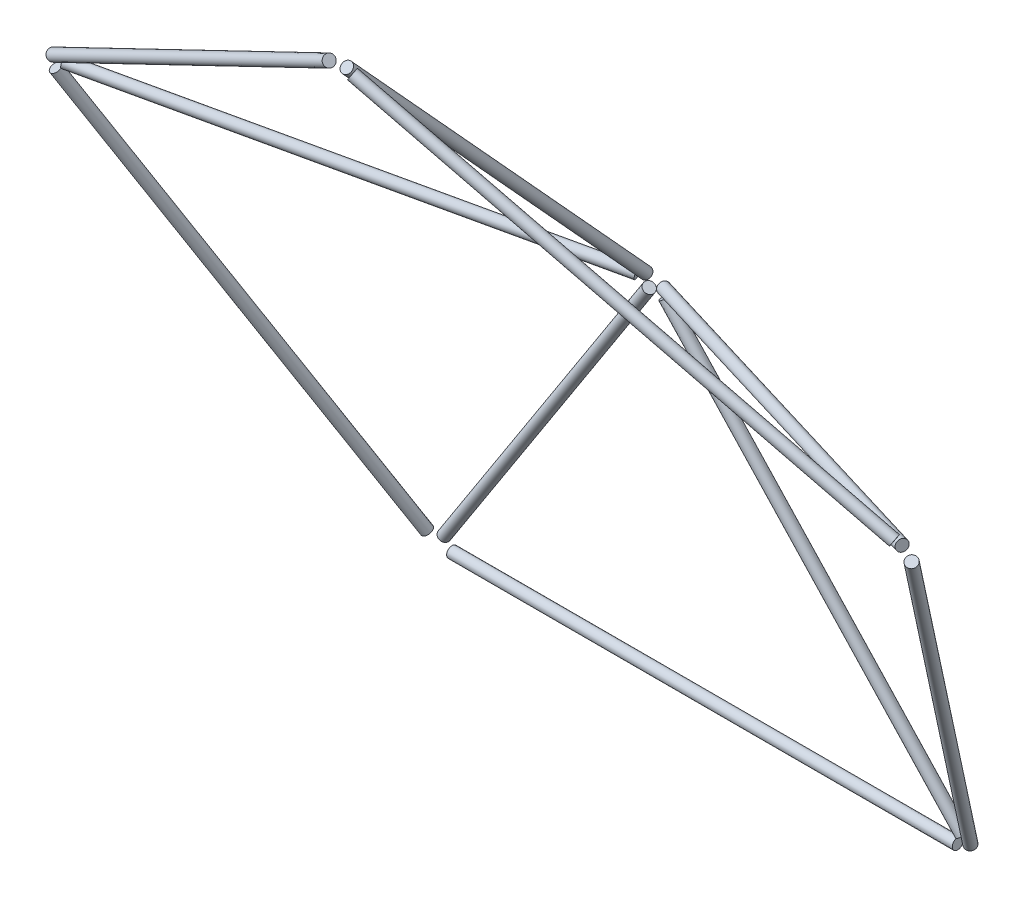
ISO-10303-21;
HEADER;
FILE_DESCRIPTION(('STEP AP214'),'2;1');
FILE_NAME('part.step','',(''),(''),'','','');
FILE_SCHEMA(('AUTOMOTIVE_DESIGN { 1 0 10303 214 1 1 1 1 }'));
ENDSEC;
DATA;
#1=APPLICATION_CONTEXT('core data for automotive mechanical design processes');
#2=APPLICATION_PROTOCOL_DEFINITION('international standard','automotive_design',2000,#1);
#3=PRODUCT_CONTEXT('',#1,'mechanical');
#4=PRODUCT('Part','Part','',(#3));
#5=PRODUCT_RELATED_PRODUCT_CATEGORY('part','',(#4));
#6=PRODUCT_DEFINITION_FORMATION('','',#4);
#7=PRODUCT_DEFINITION_CONTEXT('part definition',#1,'design');
#8=PRODUCT_DEFINITION('design','',#6,#7);
#9=PRODUCT_DEFINITION_SHAPE('','',#8);
#10=(LENGTH_UNIT() NAMED_UNIT(*) SI_UNIT(.MILLI.,.METRE.));
#11=(NAMED_UNIT(*) PLANE_ANGLE_UNIT() SI_UNIT($,.RADIAN.));
#12=(NAMED_UNIT(*) SI_UNIT($,.STERADIAN.) SOLID_ANGLE_UNIT());
#13=UNCERTAINTY_MEASURE_WITH_UNIT(LENGTH_MEASURE(1.E-05),#10,'distance_accuracy_value','');
#14=(GEOMETRIC_REPRESENTATION_CONTEXT(3) GLOBAL_UNCERTAINTY_ASSIGNED_CONTEXT((#13)) GLOBAL_UNIT_ASSIGNED_CONTEXT((#10,
#11,#12)) REPRESENTATION_CONTEXT('',''));
#15=CARTESIAN_POINT('',(0.,0.,0.));
#16=DIRECTION('',(0.,0.,1.));
#17=DIRECTION('',(1.,0.,0.));
#18=AXIS2_PLACEMENT_3D('',#15,#16,#17);
#19=CARTESIAN_POINT('',(3.23606797750098,202.053269556013,-127.226929132831));
#20=DIRECTION('',(0.809016994374942,-0.525731112119141,-0.262865556059569));
#21=DIRECTION('',(0.,0.447213595499956,-0.894427190999917));
#22=AXIS2_PLACEMENT_3D('',#19,#20,#21);
#23=PLANE('',#22);
#24=CARTESIAN_POINT('',(3.23606797750098,202.053269556013,-127.226929132831));
#25=DIRECTION('',(0.809016994374942,-0.525731112119141,-0.262865556059569));
#26=DIRECTION('',(0.,0.447213595499956,-0.894427190999917));
#27=AXIS2_PLACEMENT_3D('',#24,#25,#26);
#28=CIRCLE('',#27,1.49999999999999);
#29=CARTESIAN_POINT('',(3.23606797750098,202.724089949263,-128.568569919331));
#30=VERTEX_POINT('',#29);
#31=EDGE_CURVE('E51',#30,#30,#28,.T.);
#32=ORIENTED_EDGE('',*,*,#31,.F.);
#33=EDGE_LOOP('',(#32));
#34=FACE_BOUND('',#33,.T.);
#35=ADVANCED_FACE('F45',(#34),#23,.F.);
#36=CARTESIAN_POINT('',(116.763932022501,128.278391357067,-164.114368232304));
#37=DIRECTION('',(0.809016994374942,-0.525731112119141,-0.262865556059569));
#38=DIRECTION('',(0.,0.447213595499956,-0.894427190999917));
#39=AXIS2_PLACEMENT_3D('',#36,#37,#38);
#40=PLANE('',#39);
#41=CARTESIAN_POINT('',(116.763932022501,128.278391357067,-164.114368232304));
#42=DIRECTION('',(0.809016994374942,-0.525731112119141,-0.262865556059569));
#43=DIRECTION('',(0.,0.447213595499956,-0.894427190999917));
#44=AXIS2_PLACEMENT_3D('',#41,#42,#43);
#45=CIRCLE('',#44,1.49999999999999);
#46=CARTESIAN_POINT('',(116.763932022501,128.949211750317,-165.456009018804));
#47=VERTEX_POINT('',#46);
#48=EDGE_CURVE('E11',#47,#47,#45,.T.);
#49=ORIENTED_EDGE('',*,*,#48,.T.);
#50=EDGE_LOOP('',(#49));
#51=FACE_BOUND('',#50,.T.);
#52=ADVANCED_FACE('F60',(#51),#40,.T.);
#53=CARTESIAN_POINT('',(3.23606797750098,202.053269556013,-127.226929132831));
#54=DIRECTION('',(0.809016994374941,-0.525731112119142,-0.262865556059569));
#55=DIRECTION('',(0.,0.447213595499955,-0.894427190999917));
#56=AXIS2_PLACEMENT_3D('',#53,#54,#55);
#57=CYLINDRICAL_SURFACE('',#56,1.49999999999999);
#58=ORIENTED_EDGE('',*,*,#48,.F.);
#59=EDGE_LOOP('',(#58));
#60=FACE_BOUND('',#59,.T.);
#61=ORIENTED_EDGE('',*,*,#31,.T.);
#62=EDGE_LOOP('',(#61));
#63=FACE_BOUND('',#62,.T.);
#64=ADVANCED_FACE('F57',(#60,#63),#57,.T.);
#65=CLOSED_SHELL('',(#35,#52,#64));
#66=MANIFOLD_SOLID_BREP('B2',#65);
#67=CARTESIAN_POINT('',(-116.763932022499,128.278391357069,-164.114368232303));
#68=DIRECTION('',(0.809016994374952,0.525731112119129,0.262865556059564));
#69=DIRECTION('',(0.,0.447213595499955,-0.894427190999918));
#70=AXIS2_PLACEMENT_3D('',#67,#68,#69);
#71=PLANE('',#70);
#72=CARTESIAN_POINT('',(-116.763932022499,128.278391357069,-164.114368232303));
#73=DIRECTION('',(0.809016994374952,0.525731112119129,0.262865556059564));
#74=DIRECTION('',(0.,0.447213595499955,-0.894427190999918));
#75=AXIS2_PLACEMENT_3D('',#72,#73,#74);
#76=CIRCLE('',#75,1.49999999999999);
#77=CARTESIAN_POINT('',(-116.763932022499,128.949211750319,-165.456009018803));
#78=VERTEX_POINT('',#77);
#79=EDGE_CURVE('E99',#78,#78,#76,.T.);
#80=ORIENTED_EDGE('',*,*,#79,.F.);
#81=EDGE_LOOP('',(#80));
#82=FACE_BOUND('',#81,.T.);
#83=ADVANCED_FACE('F93',(#82),#71,.F.);
#84=CARTESIAN_POINT('',(-3.23606797749835,202.053269556013,-127.226929132831));
#85=DIRECTION('',(0.809016994374952,0.525731112119129,0.262865556059564));
#86=DIRECTION('',(0.,0.447213595499955,-0.894427190999918));
#87=AXIS2_PLACEMENT_3D('',#84,#85,#86);
#88=PLANE('',#87);
#89=CARTESIAN_POINT('',(-3.23606797749835,202.053269556013,-127.226929132831));
#90=DIRECTION('',(0.809016994374952,0.525731112119129,0.262865556059564));
#91=DIRECTION('',(0.,0.447213595499955,-0.894427190999918));
#92=AXIS2_PLACEMENT_3D('',#89,#90,#91);
#93=CIRCLE('',#92,1.49999999999999);
#94=CARTESIAN_POINT('',(-3.23606797749835,202.724089949263,-128.568569919331));
#95=VERTEX_POINT('',#94);
#96=EDGE_CURVE('E44',#95,#95,#93,.T.);
#97=ORIENTED_EDGE('',*,*,#96,.T.);
#98=EDGE_LOOP('',(#97));
#99=FACE_BOUND('',#98,.T.);
#100=ADVANCED_FACE('F108',(#99),#88,.T.);
#101=CARTESIAN_POINT('',(-116.763932022499,128.278391357069,-164.114368232303));
#102=DIRECTION('',(0.809016994374952,0.525731112119128,0.262865556059563));
#103=DIRECTION('',(0.,0.447213595499955,-0.894427190999917));
#104=AXIS2_PLACEMENT_3D('',#101,#102,#103);
#105=CYLINDRICAL_SURFACE('',#104,1.49999999999999);
#106=ORIENTED_EDGE('',*,*,#96,.F.);
#107=EDGE_LOOP('',(#106));
#108=FACE_BOUND('',#107,.T.);
#109=ORIENTED_EDGE('',*,*,#79,.T.);
#110=EDGE_LOOP('',(#109));
#111=FACE_BOUND('',#110,.T.);
#112=ADVANCED_FACE('F105',(#108,#111),#105,.T.);
#113=CLOSED_SHELL('',(#83,#100,#112));
#114=MANIFOLD_SOLID_BREP('B6',#113);
#115=CARTESIAN_POINT('',(-75.4001466274869,3.4026032334083,-226.552262294133));
#116=DIRECTION('',(-0.309016994374944,0.850650808352042,0.425325404176018));
#117=DIRECTION('',(0.,0.447213595499956,-0.894427190999917));
#118=AXIS2_PLACEMENT_3D('',#115,#116,#117);
#119=PLANE('',#118);
#120=CARTESIAN_POINT('',(-75.4001466274869,3.4026032334083,-226.552262294133));
#121=DIRECTION('',(-0.309016994374944,0.850650808352042,0.425325404176018));
#122=DIRECTION('',(0.,0.447213595499956,-0.894427190999917));
#123=AXIS2_PLACEMENT_3D('',#120,#121,#122);
#124=CIRCLE('',#123,1.49999999999999);
#125=CARTESIAN_POINT('',(-75.4001466274869,4.07342362665823,-227.893903080633));
#126=VERTEX_POINT('',#125);
#127=EDGE_CURVE('E147',#126,#126,#124,.T.);
#128=ORIENTED_EDGE('',*,*,#127,.F.);
#129=EDGE_LOOP('',(#128));
#130=FACE_BOUND('',#129,.T.);
#131=ADVANCED_FACE('F141',(#130),#119,.F.);
#132=CARTESIAN_POINT('',(-118.763932022499,122.772863675184,-166.867132073245));
#133=DIRECTION('',(-0.309016994374944,0.850650808352042,0.425325404176018));
#134=DIRECTION('',(0.,0.447213595499956,-0.894427190999917));
#135=AXIS2_PLACEMENT_3D('',#132,#133,#134);
#136=PLANE('',#135);
#137=CARTESIAN_POINT('',(-118.763932022499,122.772863675184,-166.867132073245));
#138=DIRECTION('',(-0.309016994374944,0.850650808352042,0.425325404176018));
#139=DIRECTION('',(0.,0.447213595499956,-0.894427190999917));
#140=AXIS2_PLACEMENT_3D('',#137,#138,#139);
#141=CIRCLE('',#140,1.49999999999999);
#142=CARTESIAN_POINT('',(-118.763932022499,123.443684068434,-168.208772859745));
#143=VERTEX_POINT('',#142);
#144=EDGE_CURVE('E92',#143,#143,#141,.T.);
#145=ORIENTED_EDGE('',*,*,#144,.T.);
#146=EDGE_LOOP('',(#145));
#147=FACE_BOUND('',#146,.T.);
#148=ADVANCED_FACE('F156',(#147),#136,.T.);
#149=CARTESIAN_POINT('',(-75.4001466274869,3.4026032334083,-226.552262294133));
#150=DIRECTION('',(-0.309016994374943,0.850650808352043,0.425325404176018));
#151=DIRECTION('',(0.,0.447213595499956,-0.894427190999916));
#152=AXIS2_PLACEMENT_3D('',#149,#150,#151);
#153=CYLINDRICAL_SURFACE('',#152,1.49999999999999);
#154=ORIENTED_EDGE('',*,*,#144,.F.);
#155=EDGE_LOOP('',(#154));
#156=FACE_BOUND('',#155,.T.);
#157=ORIENTED_EDGE('',*,*,#127,.T.);
#158=EDGE_LOOP('',(#157));
#159=FACE_BOUND('',#158,.T.);
#160=ADVANCED_FACE('F153',(#156,#159),#153,.T.);
#161=CLOSED_SHELL('',(#131,#148,#160));
#162=MANIFOLD_SOLID_BREP('B39',#161);
#163=CARTESIAN_POINT('',(70.1640786499878,0.,-228.253563910838));
#164=DIRECTION('',(-1.,0.,0.));
#165=DIRECTION('',(0.,0.447213595499958,-0.89442719099992));
#166=AXIS2_PLACEMENT_3D('',#163,#164,#165);
#167=PLANE('',#166);
#168=CARTESIAN_POINT('',(70.1640786499878,0.,-228.253563910838));
#169=DIRECTION('',(-1.,0.,0.));
#170=DIRECTION('',(0.,0.447213595499958,-0.89442719099992));
#171=AXIS2_PLACEMENT_3D('',#168,#169,#170);
#172=CIRCLE('',#171,1.49999999999999);
#173=CARTESIAN_POINT('',(70.1640786499878,0.670820393249941,-229.595204697338));
#174=VERTEX_POINT('',#173);
#175=EDGE_CURVE('E195',#174,#174,#172,.T.);
#176=ORIENTED_EDGE('',*,*,#175,.F.);
#177=EDGE_LOOP('',(#176));
#178=FACE_BOUND('',#177,.T.);
#179=ADVANCED_FACE('F189',(#178),#167,.F.);
#180=CARTESIAN_POINT('',(-70.1640786499873,3.46944695195361E-13,-228.253563910838));
#181=DIRECTION('',(-1.,0.,0.));
#182=DIRECTION('',(0.,0.447213595499958,-0.89442719099992));
#183=AXIS2_PLACEMENT_3D('',#180,#181,#182);
#184=PLANE('',#183);
#185=CARTESIAN_POINT('',(-70.1640786499873,3.46944695195361E-13,-228.253563910838));
#186=DIRECTION('',(-1.,0.,0.));
#187=DIRECTION('',(0.,0.447213595499958,-0.89442719099992));
#188=AXIS2_PLACEMENT_3D('',#185,#186,#187);
#189=CIRCLE('',#188,1.49999999999999);
#190=CARTESIAN_POINT('',(-70.1640786499873,0.670820393250281,-229.595204697338));
#191=VERTEX_POINT('',#190);
#192=EDGE_CURVE('E140',#191,#191,#189,.T.);
#193=ORIENTED_EDGE('',*,*,#192,.T.);
#194=EDGE_LOOP('',(#193));
#195=FACE_BOUND('',#194,.T.);
#196=ADVANCED_FACE('F204',(#195),#184,.T.);
#197=CARTESIAN_POINT('',(70.1640786499878,0.,-228.253563910838));
#198=DIRECTION('',(-1.,0.,0.));
#199=DIRECTION('',(0.,0.447213595499958,-0.89442719099992));
#200=AXIS2_PLACEMENT_3D('',#197,#198,#199);
#201=CYLINDRICAL_SURFACE('',#200,1.49999999999999);
#202=ORIENTED_EDGE('',*,*,#192,.F.);
#203=EDGE_LOOP('',(#202));
#204=FACE_BOUND('',#203,.T.);
#205=ORIENTED_EDGE('',*,*,#175,.T.);
#206=EDGE_LOOP('',(#205));
#207=FACE_BOUND('',#206,.T.);
#208=ADVANCED_FACE('F201',(#204,#207),#201,.T.);
#209=CLOSED_SHELL('',(#179,#196,#208));
#210=MANIFOLD_SOLID_BREP('B87',#209);
#211=CARTESIAN_POINT('',(3.65943097377863,107.90592178459,-213.153111338437));
#212=DIRECTION('',(0.914857743444677,0.143664716150187,0.377353625387172));
#213=DIRECTION('',(-0.229343174999504,0.954060902804784,0.192793936161055));
#214=AXIS2_PLACEMENT_3D('',#211,#212,#213);
#215=PLANE('',#214);
#216=CARTESIAN_POINT('',(3.65943097377863,107.90592178459,-213.153111338437));
#217=DIRECTION('',(0.914857743444677,0.143664716150187,0.377353625387172));
#218=DIRECTION('',(-0.229343174999504,0.954060902804784,0.192793936161055));
#219=AXIS2_PLACEMENT_3D('',#216,#217,#218);
#220=CIRCLE('',#219,1.5);
#221=CARTESIAN_POINT('',(3.31541621127938,109.337013138797,-212.863920434195));
#222=VERTEX_POINT('',#221);
#223=EDGE_CURVE('E243',#222,#222,#220,.T.);
#224=ORIENTED_EDGE('',*,*,#223,.F.);
#225=EDGE_LOOP('',(#224));
#226=FACE_BOUND('',#225,.T.);
#227=ADVANCED_FACE('F237',(#226),#215,.F.);
#228=CARTESIAN_POINT('',(116.340569026225,125.60080804399,-166.675244958095));
#229=DIRECTION('',(0.914857743444677,0.143664716150187,0.377353625387172));
#230=DIRECTION('',(-0.229343174999504,0.954060902804784,0.192793936161055));
#231=AXIS2_PLACEMENT_3D('',#228,#229,#230);
#232=PLANE('',#231);
#233=CARTESIAN_POINT('',(116.340569026225,125.60080804399,-166.675244958095));
#234=DIRECTION('',(0.914857743444677,0.143664716150187,0.377353625387172));
#235=DIRECTION('',(-0.229343174999504,0.954060902804784,0.192793936161055));
#236=AXIS2_PLACEMENT_3D('',#233,#234,#235);
#237=CIRCLE('',#236,1.5);
#238=CARTESIAN_POINT('',(115.996554263725,127.031899398197,-166.386054053853));
#239=VERTEX_POINT('',#238);
#240=EDGE_CURVE('E188',#239,#239,#237,.T.);
#241=ORIENTED_EDGE('',*,*,#240,.T.);
#242=EDGE_LOOP('',(#241));
#243=FACE_BOUND('',#242,.T.);
#244=ADVANCED_FACE('F252',(#243),#232,.T.);
#245=CARTESIAN_POINT('',(3.65943097377863,107.90592178459,-213.153111338437));
#246=DIRECTION('',(0.914857743444679,0.143664716150186,0.377353625387173));
#247=DIRECTION('',(-0.229343174999503,0.954060902804784,0.192793936161055));
#248=AXIS2_PLACEMENT_3D('',#245,#246,#247);
#249=CYLINDRICAL_SURFACE('',#248,1.5);
#250=ORIENTED_EDGE('',*,*,#240,.F.);
#251=EDGE_LOOP('',(#250));
#252=FACE_BOUND('',#251,.T.);
#253=ORIENTED_EDGE('',*,*,#223,.T.);
#254=EDGE_LOOP('',(#253));
#255=FACE_BOUND('',#254,.T.);
#256=ADVANCED_FACE('F249',(#252,#255),#249,.T.);
#257=CLOSED_SHELL('',(#227,#244,#256));
#258=MANIFOLD_SOLID_BREP('B135',#257);
#259=CARTESIAN_POINT('',(4.44089209850063E-13,110.283964185361,-211.964090138051));
#260=DIRECTION('',(0.,0.738175316342915,0.67460892548354));
#261=DIRECTION('',(-0.964443775627127,0.178291116075975,-0.195090957203359));
#262=AXIS2_PLACEMENT_3D('',#259,#260,#261);
#263=PLANE('',#262);
#264=CARTESIAN_POINT('',(4.44089209850063E-13,110.283964185361,-211.964090138051));
#265=DIRECTION('',(0.,0.738175316342915,0.67460892548354));
#266=DIRECTION('',(-0.964443775627127,0.178291116075975,-0.195090957203359));
#267=AXIS2_PLACEMENT_3D('',#264,#265,#266);
#268=CIRCLE('',#267,1.5);
#269=CARTESIAN_POINT('',(-1.44666566344024,110.551400859475,-212.256726573856));
#270=VERTEX_POINT('',#269);
#271=EDGE_CURVE('E291',#270,#270,#268,.T.);
#272=ORIENTED_EDGE('',*,*,#271,.F.);
#273=EDGE_LOOP('',(#272));
#274=FACE_BOUND('',#273,.T.);
#275=ADVANCED_FACE('F285',(#274),#263,.F.);
#276=CARTESIAN_POINT('',(1.48492329543615E-12,201.203492739118,-128.87390261053));
#277=DIRECTION('',(0.,0.738175316342915,0.67460892548354));
#278=DIRECTION('',(-0.964443775627127,0.178291116075975,-0.195090957203359));
#279=AXIS2_PLACEMENT_3D('',#276,#277,#278);
#280=PLANE('',#279);
#281=CARTESIAN_POINT('',(1.48492329543615E-12,201.203492739118,-128.87390261053));
#282=DIRECTION('',(0.,0.738175316342915,0.67460892548354));
#283=DIRECTION('',(-0.964443775627127,0.178291116075975,-0.195090957203359));
#284=AXIS2_PLACEMENT_3D('',#281,#282,#283);
#285=CIRCLE('',#284,1.5);
#286=CARTESIAN_POINT('',(-1.4466656634392,201.470929413231,-129.166539046335));
#287=VERTEX_POINT('',#286);
#288=EDGE_CURVE('E236',#287,#287,#285,.T.);
#289=ORIENTED_EDGE('',*,*,#288,.T.);
#290=EDGE_LOOP('',(#289));
#291=FACE_BOUND('',#290,.T.);
#292=ADVANCED_FACE('F300',(#291),#280,.T.);
#293=CARTESIAN_POINT('',(4.44089209850063E-13,110.283964185361,-211.964090138051));
#294=DIRECTION('',(0.,0.738175316342915,0.674608925483541));
#295=DIRECTION('',(-0.964443775627128,0.178291116075975,-0.195090957203356));
#296=AXIS2_PLACEMENT_3D('',#293,#294,#295);
#297=CYLINDRICAL_SURFACE('',#296,1.5);
#298=ORIENTED_EDGE('',*,*,#288,.F.);
#299=EDGE_LOOP('',(#298));
#300=FACE_BOUND('',#299,.T.);
#301=ORIENTED_EDGE('',*,*,#271,.T.);
#302=EDGE_LOOP('',(#301));
#303=FACE_BOUND('',#302,.T.);
#304=ADVANCED_FACE('F297',(#300,#303),#297,.T.);
#305=CLOSED_SHELL('',(#275,#292,#304));
#306=MANIFOLD_SOLID_BREP('B183',#305);
#307=CARTESIAN_POINT('',(-3.65943097377794,107.90592178459,-213.153111338437));
#308=DIRECTION('',(-0.914857743444675,0.1436647161502,0.377353625387176));
#309=DIRECTION('',(-0.366715858576331,-0.686748851889798,-0.627610941186252));
#310=AXIS2_PLACEMENT_3D('',#307,#308,#309);
#311=PLANE('',#310);
#312=CARTESIAN_POINT('',(-3.65943097377794,107.90592178459,-213.153111338437));
#313=DIRECTION('',(-0.914857743444675,0.1436647161502,0.377353625387176));
#314=DIRECTION('',(-0.366715858576331,-0.686748851889798,-0.627610941186252));
#315=AXIS2_PLACEMENT_3D('',#312,#313,#314);
#316=CIRCLE('',#315,1.5);
#317=CARTESIAN_POINT('',(-4.20950476164243,106.875798506756,-214.094527750216));
#318=VERTEX_POINT('',#317);
#319=EDGE_CURVE('E339',#318,#318,#316,.T.);
#320=ORIENTED_EDGE('',*,*,#319,.F.);
#321=EDGE_LOOP('',(#320));
#322=FACE_BOUND('',#321,.T.);
#323=ADVANCED_FACE('F333',(#322),#311,.F.);
#324=CARTESIAN_POINT('',(-116.340569026223,125.600808043992,-166.675244958094));
#325=DIRECTION('',(-0.914857743444675,0.1436647161502,0.377353625387176));
#326=DIRECTION('',(-0.366715858576331,-0.686748851889798,-0.627610941186252));
#327=AXIS2_PLACEMENT_3D('',#324,#325,#326);
#328=PLANE('',#327);
#329=CARTESIAN_POINT('',(-116.340569026223,125.600808043992,-166.675244958094));
#330=DIRECTION('',(-0.914857743444675,0.1436647161502,0.377353625387176));
#331=DIRECTION('',(-0.366715858576331,-0.686748851889798,-0.627610941186252));
#332=AXIS2_PLACEMENT_3D('',#329,#330,#331);
#333=CIRCLE('',#332,1.5);
#334=CARTESIAN_POINT('',(-116.890642814088,124.570684766157,-167.616661369873));
#335=VERTEX_POINT('',#334);
#336=EDGE_CURVE('E284',#335,#335,#333,.T.);
#337=ORIENTED_EDGE('',*,*,#336,.T.);
#338=EDGE_LOOP('',(#337));
#339=FACE_BOUND('',#338,.T.);
#340=ADVANCED_FACE('F348',(#339),#328,.T.);
#341=CARTESIAN_POINT('',(-3.65943097377794,107.90592178459,-213.153111338437));
#342=DIRECTION('',(-0.914857743444674,0.143664716150201,0.377353625387177));
#343=DIRECTION('',(-0.366715858576333,-0.686748851889798,-0.627610941186251));
#344=AXIS2_PLACEMENT_3D('',#341,#342,#343);
#345=CYLINDRICAL_SURFACE('',#344,1.5);
#346=ORIENTED_EDGE('',*,*,#336,.F.);
#347=EDGE_LOOP('',(#346));
#348=FACE_BOUND('',#347,.T.);
#349=ORIENTED_EDGE('',*,*,#319,.T.);
#350=EDGE_LOOP('',(#349));
#351=FACE_BOUND('',#350,.T.);
#352=ADVANCED_FACE('F345',(#348,#351),#345,.T.);
#353=CLOSED_SHELL('',(#323,#340,#352));
#354=MANIFOLD_SOLID_BREP('B231',#353);
#355=CARTESIAN_POINT('',(-2.26165272127875,104.058168353455,-215.076988054005));
#356=DIRECTION('',(-0.565413180319841,-0.818273641633722,-0.103615553504793));
#357=DIRECTION('',(0.737800910813355,-0.445603166990952,-0.507038098736824));
#358=AXIS2_PLACEMENT_3D('',#355,#356,#357);
#359=PLANE('',#358);
#360=CARTESIAN_POINT('',(-2.26165272127875,104.058168353455,-215.076988054005));
#361=DIRECTION('',(-0.565413180319841,-0.818273641633722,-0.103615553504793));
#362=DIRECTION('',(0.737800910813355,-0.445603166990952,-0.507038098736824));
#363=AXIS2_PLACEMENT_3D('',#360,#361,#362);
#364=CIRCLE('',#363,1.5);
#365=CARTESIAN_POINT('',(-1.15495135505872,103.389763602969,-215.83754520211));
#366=VERTEX_POINT('',#365);
#367=EDGE_CURVE('E387',#366,#366,#364,.T.);
#368=ORIENTED_EDGE('',*,*,#367,.F.);
#369=EDGE_LOOP('',(#368));
#370=FACE_BOUND('',#369,.T.);
#371=ADVANCED_FACE('F381',(#370),#359,.F.);
#372=CARTESIAN_POINT('',(-71.9024259287097,3.27309456653526,-227.839101696823));
#373=DIRECTION('',(-0.565413180319841,-0.818273641633722,-0.103615553504793));
#374=DIRECTION('',(0.737800910813355,-0.445603166990952,-0.507038098736824));
#375=AXIS2_PLACEMENT_3D('',#372,#373,#374);
#376=PLANE('',#375);
#377=CARTESIAN_POINT('',(-71.9024259287097,3.27309456653526,-227.839101696823));
#378=DIRECTION('',(-0.565413180319841,-0.818273641633722,-0.103615553504793));
#379=DIRECTION('',(0.737800910813355,-0.445603166990952,-0.507038098736824));
#380=AXIS2_PLACEMENT_3D('',#377,#378,#379);
#381=CIRCLE('',#380,1.5);
#382=CARTESIAN_POINT('',(-70.7957245624896,2.60468981604883,-228.599658844928));
#383=VERTEX_POINT('',#382);
#384=EDGE_CURVE('E332',#383,#383,#381,.T.);
#385=ORIENTED_EDGE('',*,*,#384,.T.);
#386=EDGE_LOOP('',(#385));
#387=FACE_BOUND('',#386,.T.);
#388=ADVANCED_FACE('F396',(#387),#376,.T.);
#389=CARTESIAN_POINT('',(-2.26165272127875,104.058168353455,-215.076988054005));
#390=DIRECTION('',(-0.565413180319843,-0.818273641633721,-0.103615553504791));
#391=DIRECTION('',(0.737800910813355,-0.445603166990953,-0.507038098736824));
#392=AXIS2_PLACEMENT_3D('',#389,#390,#391);
#393=CYLINDRICAL_SURFACE('',#392,1.5);
#394=ORIENTED_EDGE('',*,*,#384,.F.);
#395=EDGE_LOOP('',(#394));
#396=FACE_BOUND('',#395,.T.);
#397=ORIENTED_EDGE('',*,*,#367,.T.);
#398=EDGE_LOOP('',(#397));
#399=FACE_BOUND('',#398,.T.);
#400=ADVANCED_FACE('F393',(#396,#399),#393,.T.);
#401=CLOSED_SHELL('',(#371,#388,#400));
#402=MANIFOLD_SOLID_BREP('B279',#401);
#403=CARTESIAN_POINT('',(118.7639320225,122.772863675184,-166.867132073245));
#404=DIRECTION('',(-0.309016994374946,-0.850650808352041,-0.42532540417602));
#405=DIRECTION('',(0.,0.447213595499957,-0.894427190999916));
#406=AXIS2_PLACEMENT_3D('',#403,#404,#405);
#407=PLANE('',#406);
#408=CARTESIAN_POINT('',(118.7639320225,122.772863675184,-166.867132073245));
#409=DIRECTION('',(-0.309016994374946,-0.850650808352041,-0.42532540417602));
#410=DIRECTION('',(0.,0.447213595499957,-0.894427190999916));
#411=AXIS2_PLACEMENT_3D('',#408,#409,#410);
#412=CIRCLE('',#411,1.49999999999999);
#413=CARTESIAN_POINT('',(118.7639320225,123.443684068434,-168.208772859745));
#414=VERTEX_POINT('',#413);
#415=EDGE_CURVE('E435',#414,#414,#412,.T.);
#416=ORIENTED_EDGE('',*,*,#415,.F.);
#417=EDGE_LOOP('',(#416));
#418=FACE_BOUND('',#417,.T.);
#419=ADVANCED_FACE('F429',(#418),#407,.F.);
#420=CARTESIAN_POINT('',(75.4001466274871,3.40260323340817,-226.552262294133));
#421=DIRECTION('',(-0.309016994374946,-0.850650808352041,-0.42532540417602));
#422=DIRECTION('',(0.,0.447213595499957,-0.894427190999916));
#423=AXIS2_PLACEMENT_3D('',#420,#421,#422);
#424=PLANE('',#423);
#425=CARTESIAN_POINT('',(75.4001466274871,3.40260323340817,-226.552262294133));
#426=DIRECTION('',(-0.309016994374946,-0.850650808352041,-0.42532540417602));
#427=DIRECTION('',(0.,0.447213595499957,-0.894427190999916));
#428=AXIS2_PLACEMENT_3D('',#425,#426,#427);
#429=CIRCLE('',#428,1.49999999999999);
#430=CARTESIAN_POINT('',(75.4001466274871,4.0734236266581,-227.893903080633));
#431=VERTEX_POINT('',#430);
#432=EDGE_CURVE('E380',#431,#431,#429,.T.);
#433=ORIENTED_EDGE('',*,*,#432,.T.);
#434=EDGE_LOOP('',(#433));
#435=FACE_BOUND('',#434,.T.);
#436=ADVANCED_FACE('F444',(#435),#424,.T.);
#437=CARTESIAN_POINT('',(118.7639320225,122.772863675184,-166.867132073245));
#438=DIRECTION('',(-0.309016994374946,-0.850650808352041,-0.425325404176019));
#439=DIRECTION('',(0.,0.447213595499957,-0.894427190999916));
#440=AXIS2_PLACEMENT_3D('',#437,#438,#439);
#441=CYLINDRICAL_SURFACE('',#440,1.49999999999999);
#442=ORIENTED_EDGE('',*,*,#432,.F.);
#443=EDGE_LOOP('',(#442));
#444=FACE_BOUND('',#443,.T.);
#445=ORIENTED_EDGE('',*,*,#415,.T.);
#446=EDGE_LOOP('',(#445));
#447=FACE_BOUND('',#446,.T.);
#448=ADVANCED_FACE('F441',(#444,#447),#441,.T.);
#449=CLOSED_SHELL('',(#419,#436,#448));
#450=MANIFOLD_SOLID_BREP('B327',#449);
#451=CARTESIAN_POINT('',(2.26165272127937,104.058168353455,-215.076988054004));
#452=DIRECTION('',(0.565413180319841,-0.818273641633723,-0.10361555350479));
#453=DIRECTION('',(0.822701898389611,0.568473030482678,0.));
#454=AXIS2_PLACEMENT_3D('',#451,#452,#453);
#455=PLANE('',#454);
#456=CARTESIAN_POINT('',(2.26165272127937,104.058168353455,-215.076988054004));
#457=DIRECTION('',(0.565413180319841,-0.818273641633723,-0.10361555350479));
#458=DIRECTION('',(0.822701898389611,0.568473030482678,0.));
#459=AXIS2_PLACEMENT_3D('',#456,#457,#458);
#460=CIRCLE('',#459,1.5);
#461=CARTESIAN_POINT('',(3.49570556886379,104.910877899179,-215.076988054004));
#462=VERTEX_POINT('',#461);
#463=EDGE_CURVE('E485',#462,#462,#460,.T.);
#464=ORIENTED_EDGE('',*,*,#463,.F.);
#465=EDGE_LOOP('',(#464));
#466=FACE_BOUND('',#465,.T.);
#467=ADVANCED_FACE('F479',(#466),#455,.F.);
#468=CARTESIAN_POINT('',(71.9024259287099,3.27309456653489,-227.839101696823));
#469=DIRECTION('',(0.565413180319841,-0.818273641633723,-0.10361555350479));
#470=DIRECTION('',(0.822701898389611,0.568473030482678,0.));
#471=AXIS2_PLACEMENT_3D('',#468,#469,#470);
#472=PLANE('',#471);
#473=CARTESIAN_POINT('',(71.9024259287099,3.27309456653489,-227.839101696823));
#474=DIRECTION('',(0.565413180319841,-0.818273641633723,-0.10361555350479));
#475=DIRECTION('',(0.822701898389611,0.568473030482678,0.));
#476=AXIS2_PLACEMENT_3D('',#473,#474,#475);
#477=CIRCLE('',#476,1.5);
#478=CARTESIAN_POINT('',(73.1364787762943,4.12580411225891,-227.839101696823));
#479=VERTEX_POINT('',#478);
#480=EDGE_CURVE('E428',#479,#479,#477,.T.);
#481=ORIENTED_EDGE('',*,*,#480,.T.);
#482=EDGE_LOOP('',(#481));
#483=FACE_BOUND('',#482,.T.);
#484=ADVANCED_FACE('F494',(#483),#472,.T.);
#485=CARTESIAN_POINT('',(2.26165272127937,104.058168353455,-215.076988054004));
#486=DIRECTION('',(0.565413180319838,-0.818273641633723,-0.103615553504791));
#487=DIRECTION('',(0.822701898389613,0.568473030482677,0.));
#488=AXIS2_PLACEMENT_3D('',#485,#486,#487);
#489=CYLINDRICAL_SURFACE('',#488,1.5);
#490=ORIENTED_EDGE('',*,*,#480,.F.);
#491=EDGE_LOOP('',(#490));
#492=FACE_BOUND('',#491,.T.);
#493=ORIENTED_EDGE('',*,*,#463,.T.);
#494=EDGE_LOOP('',(#493));
#495=FACE_BOUND('',#494,.T.);
#496=ADVANCED_FACE('F491',(#492,#495),#489,.T.);
#497=CLOSED_SHELL('',(#467,#484,#496));
#498=MANIFOLD_SOLID_BREP('B375',#497);
#499=ADVANCED_BREP_SHAPE_REPRESENTATION('',(#18,#66,#114,#162,#210,#258,#306,#354,#402,#450,
#498),#14);
#500=SHAPE_DEFINITION_REPRESENTATION(#9,#499);
ENDSEC;
END-ISO-10303-21;
